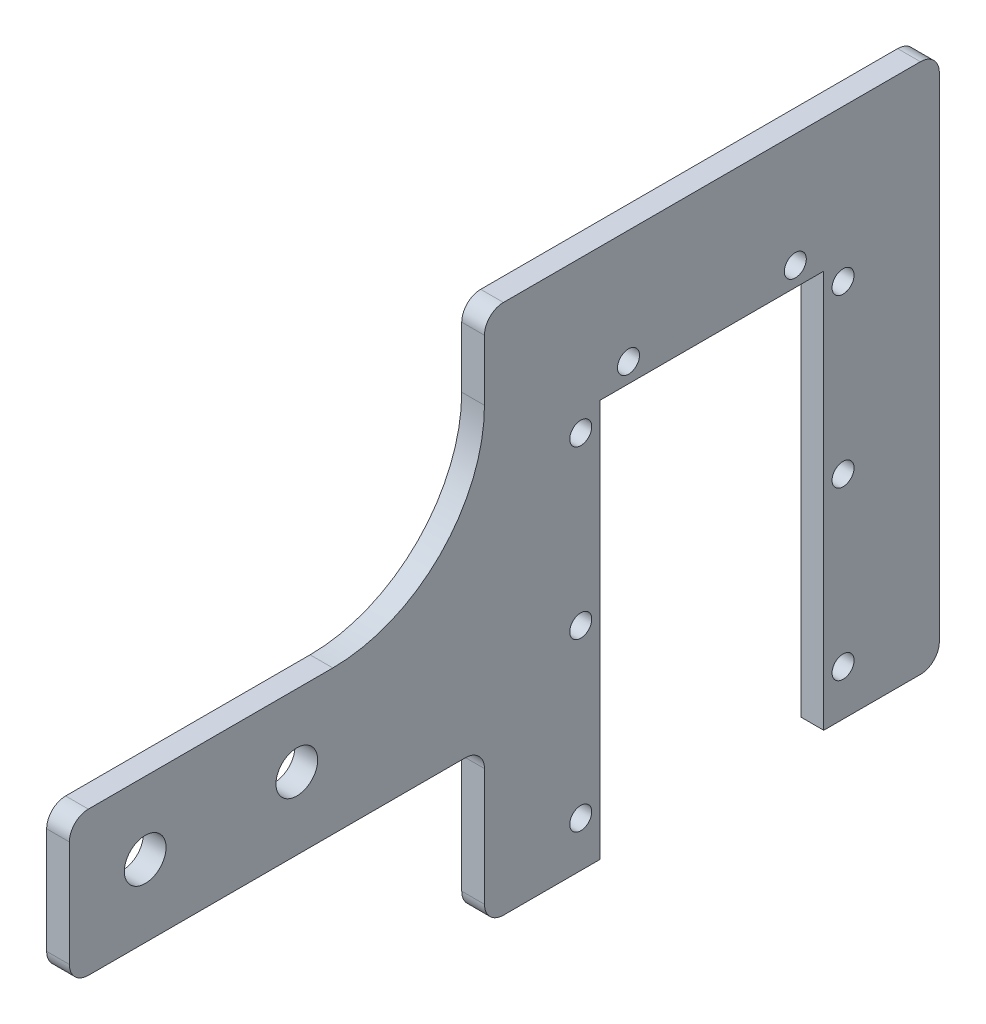
ISO-10303-21;
HEADER;
FILE_DESCRIPTION(('STEP AP214'),'2;1');
FILE_NAME('part.step','',(''),(''),'','','');
FILE_SCHEMA(('AUTOMOTIVE_DESIGN { 1 0 10303 214 1 1 1 1 }'));
ENDSEC;
DATA;
#1=APPLICATION_CONTEXT('core data for automotive mechanical design processes');
#2=APPLICATION_PROTOCOL_DEFINITION('international standard','automotive_design',2000,#1);
#3=PRODUCT_CONTEXT('',#1,'mechanical');
#4=PRODUCT('Part','Part','',(#3));
#5=PRODUCT_RELATED_PRODUCT_CATEGORY('part','',(#4));
#6=PRODUCT_DEFINITION_FORMATION('','',#4);
#7=PRODUCT_DEFINITION_CONTEXT('part definition',#1,'design');
#8=PRODUCT_DEFINITION('design','',#6,#7);
#9=PRODUCT_DEFINITION_SHAPE('','',#8);
#10=(LENGTH_UNIT() NAMED_UNIT(*) SI_UNIT(.MILLI.,.METRE.));
#11=(NAMED_UNIT(*) PLANE_ANGLE_UNIT() SI_UNIT($,.RADIAN.));
#12=(NAMED_UNIT(*) SI_UNIT($,.STERADIAN.) SOLID_ANGLE_UNIT());
#13=UNCERTAINTY_MEASURE_WITH_UNIT(LENGTH_MEASURE(1.E-05),#10,'distance_accuracy_value','');
#14=(GEOMETRIC_REPRESENTATION_CONTEXT(3) GLOBAL_UNCERTAINTY_ASSIGNED_CONTEXT((#13)) GLOBAL_UNIT_ASSIGNED_CONTEXT((#10,
#11,#12)) REPRESENTATION_CONTEXT('',''));
#15=CARTESIAN_POINT('',(0.,0.,0.));
#16=DIRECTION('',(0.,0.,1.));
#17=DIRECTION('',(1.,0.,0.));
#18=AXIS2_PLACEMENT_3D('',#15,#16,#17);
#19=CARTESIAN_POINT('',(1.5,60.,29.9999999999755));
#20=DIRECTION('',(0.,-3.49868943340579E-13,-1.));
#21=DIRECTION('',(0.,1.,-3.49868943340579E-13));
#22=AXIS2_PLACEMENT_3D('',#19,#20,#21);
#23=PLANE('',#22);
#24=DIRECTION('',(0.,-1.,3.49868943340579E-13));
#25=VECTOR('',#24,1.);
#26=CARTESIAN_POINT('',(1.5,60.,29.9999999999755));
#27=LINE('',#26,#25);
#28=CARTESIAN_POINT('',(1.5,7.99999999999873,29.9999999999937));
#29=VERTEX_POINT('',#28);
#30=CARTESIAN_POINT('',(1.5,-7.49999999999913,29.9999999999991));
#31=VERTEX_POINT('',#30);
#32=EDGE_CURVE('E325',#29,#31,#27,.T.);
#33=ORIENTED_EDGE('',*,*,#32,.F.);
#34=DIRECTION('',(1.,0.,0.));
#35=VECTOR('',#34,1.);
#36=CARTESIAN_POINT('',(-1.5,7.99999999999873,29.9999999999937));
#37=LINE('',#36,#35);
#38=CARTESIAN_POINT('',(-1.5,7.99999999999873,29.9999999999937));
#39=VERTEX_POINT('',#38);
#40=EDGE_CURVE('E257',#29,#39,#37,.F.);
#41=ORIENTED_EDGE('',*,*,#40,.T.);
#42=DIRECTION('',(0.,-1.,3.49868943340579E-13));
#43=VECTOR('',#42,1.);
#44=CARTESIAN_POINT('',(-1.5,60.,29.9999999999755));
#45=LINE('',#44,#43);
#46=CARTESIAN_POINT('',(-1.5,-7.49999999999913,29.9999999999991));
#47=VERTEX_POINT('',#46);
#48=EDGE_CURVE('E213',#39,#47,#45,.T.);
#49=ORIENTED_EDGE('',*,*,#48,.T.);
#50=DIRECTION('',(-1.,0.,0.));
#51=VECTOR('',#50,1.);
#52=CARTESIAN_POINT('',(1.5,-7.49999999999913,29.9999999999991));
#53=LINE('',#52,#51);
#54=EDGE_CURVE('E255',#47,#31,#53,.F.);
#55=ORIENTED_EDGE('',*,*,#54,.T.);
#56=EDGE_LOOP('',(#33,#41,#49,#55));
#57=FACE_BOUND('',#56,.T.);
#58=ADVANCED_FACE('F32',(#57),#23,.F.);
#59=CARTESIAN_POINT('',(-1.5,57.5000000000009,29.9999999999764));
#60=VERTEX_POINT('',#59);
#61=CARTESIAN_POINT('',(-1.5,49.4999999999925,29.9999999999792));
#62=VERTEX_POINT('',#61);
#63=EDGE_CURVE('E214',#60,#62,#45,.T.);
#64=ORIENTED_EDGE('',*,*,#63,.T.);
#65=DIRECTION('',(-1.,0.,0.));
#66=VECTOR('',#65,1.);
#67=CARTESIAN_POINT('',(1.5,49.4999999999925,29.9999999999792));
#68=LINE('',#67,#66);
#69=CARTESIAN_POINT('',(1.5,49.4999999999925,29.9999999999792));
#70=VERTEX_POINT('',#69);
#71=EDGE_CURVE('E53',#62,#70,#68,.F.);
#72=ORIENTED_EDGE('',*,*,#71,.T.);
#73=CARTESIAN_POINT('',(1.5,57.5000000000009,29.9999999999764));
#74=VERTEX_POINT('',#73);
#75=EDGE_CURVE('E181',#74,#70,#27,.T.);
#76=ORIENTED_EDGE('',*,*,#75,.F.);
#77=DIRECTION('',(-1.,0.,0.));
#78=VECTOR('',#77,1.);
#79=CARTESIAN_POINT('',(1.5,57.5000000000009,29.9999999999764));
#80=LINE('',#79,#78);
#81=EDGE_CURVE('E288',#74,#60,#80,.T.);
#82=ORIENTED_EDGE('',*,*,#81,.T.);
#83=EDGE_LOOP('',(#64,#72,#76,#82));
#84=FACE_BOUND('',#83,.T.);
#85=ADVANCED_FACE('F370',(#84),#23,.F.);
#86=CARTESIAN_POINT('',(1.5,60.,-30.0000000000245));
#87=DIRECTION('',(0.,3.49819379812694E-13,1.));
#88=DIRECTION('',(0.,-1.,3.49819379812694E-13));
#89=AXIS2_PLACEMENT_3D('',#86,#87,#88);
#90=PLANE('',#89);
#91=DIRECTION('',(0.,1.,-3.49819379812694E-13));
#92=VECTOR('',#91,1.);
#93=CARTESIAN_POINT('',(1.5,60.,-30.0000000000245));
#94=LINE('',#93,#92);
#95=CARTESIAN_POINT('',(1.5,-7.50000000000087,-30.0000000000009));
#96=VERTEX_POINT('',#95);
#97=CARTESIAN_POINT('',(1.5,57.4999999999991,-30.0000000000236));
#98=VERTEX_POINT('',#97);
#99=EDGE_CURVE('E226',#96,#98,#94,.T.);
#100=ORIENTED_EDGE('',*,*,#99,.F.);
#101=DIRECTION('',(-1.,0.,0.));
#102=VECTOR('',#101,1.);
#103=CARTESIAN_POINT('',(1.5,-7.50000000000087,-30.0000000000009));
#104=LINE('',#103,#102);
#105=CARTESIAN_POINT('',(-1.5,-7.50000000000087,-30.0000000000009));
#106=VERTEX_POINT('',#105);
#107=EDGE_CURVE('E261',#96,#106,#104,.T.);
#108=ORIENTED_EDGE('',*,*,#107,.T.);
#109=DIRECTION('',(0.,1.,-3.49819379812694E-13));
#110=VECTOR('',#109,1.);
#111=CARTESIAN_POINT('',(-1.5,60.,-30.0000000000245));
#112=LINE('',#111,#110);
#113=CARTESIAN_POINT('',(-1.5,57.4999999999991,-30.0000000000236));
#114=VERTEX_POINT('',#113);
#115=EDGE_CURVE('E206',#106,#114,#112,.T.);
#116=ORIENTED_EDGE('',*,*,#115,.T.);
#117=DIRECTION('',(-1.,0.,0.));
#118=VECTOR('',#117,1.);
#119=CARTESIAN_POINT('',(1.5,57.4999999999991,-30.0000000000236));
#120=LINE('',#119,#118);
#121=EDGE_CURVE('E259',#114,#98,#120,.F.);
#122=ORIENTED_EDGE('',*,*,#121,.T.);
#123=EDGE_LOOP('',(#100,#108,#116,#122));
#124=FACE_BOUND('',#123,.T.);
#125=ADVANCED_FACE('F356',(#124),#90,.F.);
#126=CARTESIAN_POINT('',(1.5,60.,-30.0000000000245));
#127=DIRECTION('',(0.,-1.,0.));
#128=DIRECTION('',(0.,0.,-1.));
#129=AXIS2_PLACEMENT_3D('',#126,#127,#128);
#130=PLANE('',#129);
#131=DIRECTION('',(0.,0.,1.));
#132=VECTOR('',#131,1.);
#133=CARTESIAN_POINT('',(1.5,60.,-30.0000000000245));
#134=LINE('',#133,#132);
#135=CARTESIAN_POINT('',(1.5,60.,-27.5000000000236));
#136=VERTEX_POINT('',#135);
#137=CARTESIAN_POINT('',(1.5,60.,27.4999999999764));
#138=VERTEX_POINT('',#137);
#139=EDGE_CURVE('E323',#136,#138,#134,.T.);
#140=ORIENTED_EDGE('',*,*,#139,.F.);
#141=DIRECTION('',(-1.,0.,0.));
#142=VECTOR('',#141,1.);
#143=CARTESIAN_POINT('',(1.5,60.,-27.5000000000236));
#144=LINE('',#143,#142);
#145=CARTESIAN_POINT('',(-1.5,60.,-27.5000000000236));
#146=VERTEX_POINT('',#145);
#147=EDGE_CURVE('E285',#136,#146,#144,.T.);
#148=ORIENTED_EDGE('',*,*,#147,.T.);
#149=DIRECTION('',(0.,0.,1.));
#150=VECTOR('',#149,1.);
#151=CARTESIAN_POINT('',(-1.5,60.,-30.0000000000245));
#152=LINE('',#151,#150);
#153=CARTESIAN_POINT('',(-1.5,60.,27.4999999999764));
#154=VERTEX_POINT('',#153);
#155=EDGE_CURVE('E209',#146,#154,#152,.T.);
#156=ORIENTED_EDGE('',*,*,#155,.T.);
#157=DIRECTION('',(-1.,0.,0.));
#158=VECTOR('',#157,1.);
#159=CARTESIAN_POINT('',(1.5,60.,27.4999999999764));
#160=LINE('',#159,#158);
#161=EDGE_CURVE('E283',#154,#138,#160,.F.);
#162=ORIENTED_EDGE('',*,*,#161,.T.);
#163=EDGE_LOOP('',(#140,#148,#156,#162));
#164=FACE_BOUND('',#163,.T.);
#165=ADVANCED_FACE('F364',(#164),#130,.F.);
#166=CARTESIAN_POINT('',(1.5,-10.,30.));
#167=DIRECTION('',(0.,1.,0.));
#168=DIRECTION('',(0.,0.,1.));
#169=AXIS2_PLACEMENT_3D('',#166,#167,#168);
#170=PLANE('',#169);
#171=DIRECTION('',(0.,0.,-1.));
#172=VECTOR('',#171,1.);
#173=CARTESIAN_POINT('',(1.5,-10.,30.));
#174=LINE('',#173,#172);
#175=CARTESIAN_POINT('',(1.5,-10.,27.4999999999991));
#176=VERTEX_POINT('',#175);
#177=CARTESIAN_POINT('',(1.5,-10.,14.75));
#178=VERTEX_POINT('',#177);
#179=EDGE_CURVE('E168',#176,#178,#174,.T.);
#180=ORIENTED_EDGE('',*,*,#179,.F.);
#181=DIRECTION('',(-1.,0.,0.));
#182=VECTOR('',#181,1.);
#183=CARTESIAN_POINT('',(1.5,-10.,27.4999999999991));
#184=LINE('',#183,#182);
#185=CARTESIAN_POINT('',(-1.5,-10.,27.4999999999991));
#186=VERTEX_POINT('',#185);
#187=EDGE_CURVE('E281',#176,#186,#184,.T.);
#188=ORIENTED_EDGE('',*,*,#187,.T.);
#189=DIRECTION('',(0.,0.,-1.));
#190=VECTOR('',#189,1.);
#191=CARTESIAN_POINT('',(-1.5,-10.,30.));
#192=LINE('',#191,#190);
#193=CARTESIAN_POINT('',(-1.5,-10.,14.75));
#194=VERTEX_POINT('',#193);
#195=EDGE_CURVE('E187',#186,#194,#192,.T.);
#196=ORIENTED_EDGE('',*,*,#195,.T.);
#197=DIRECTION('',(-1.,0.,0.));
#198=VECTOR('',#197,1.);
#199=CARTESIAN_POINT('',(1.5,-10.,14.75));
#200=LINE('',#199,#198);
#201=EDGE_CURVE('E184',#178,#194,#200,.T.);
#202=ORIENTED_EDGE('',*,*,#201,.F.);
#203=EDGE_LOOP('',(#180,#188,#196,#202));
#204=FACE_BOUND('',#203,.T.);
#205=ADVANCED_FACE('F185',(#204),#170,.F.);
#206=CARTESIAN_POINT('',(1.5,42.45,14.75));
#207=DIRECTION('',(0.,0.,1.));
#208=DIRECTION('',(0.,-1.,0.));
#209=AXIS2_PLACEMENT_3D('',#206,#207,#208);
#210=PLANE('',#209);
#211=DIRECTION('',(-1.,0.,0.));
#212=VECTOR('',#211,1.);
#213=CARTESIAN_POINT('',(1.5,42.45,14.75));
#214=LINE('',#213,#212);
#215=CARTESIAN_POINT('',(1.5,42.45,14.75));
#216=VERTEX_POINT('',#215);
#217=CARTESIAN_POINT('',(-1.5,42.45,14.75));
#218=VERTEX_POINT('',#217);
#219=EDGE_CURVE('E191',#216,#218,#214,.T.);
#220=ORIENTED_EDGE('',*,*,#219,.F.);
#221=DIRECTION('',(0.,1.,0.));
#222=VECTOR('',#221,1.);
#223=CARTESIAN_POINT('',(1.5,42.45,14.75));
#224=LINE('',#223,#222);
#225=EDGE_CURVE('E173',#178,#216,#224,.T.);
#226=ORIENTED_EDGE('',*,*,#225,.F.);
#227=ORIENTED_EDGE('',*,*,#201,.T.);
#228=DIRECTION('',(0.,1.,0.));
#229=VECTOR('',#228,1.);
#230=CARTESIAN_POINT('',(-1.5,42.45,14.75));
#231=LINE('',#230,#229);
#232=EDGE_CURVE('E217',#194,#218,#231,.T.);
#233=ORIENTED_EDGE('',*,*,#232,.T.);
#234=EDGE_LOOP('',(#220,#226,#227,#233));
#235=FACE_BOUND('',#234,.T.);
#236=ADVANCED_FACE('F193',(#235),#210,.F.);
#237=CARTESIAN_POINT('',(1.5,42.45,-14.75));
#238=DIRECTION('',(0.,1.,0.));
#239=DIRECTION('',(0.,0.,1.));
#240=AXIS2_PLACEMENT_3D('',#237,#238,#239);
#241=PLANE('',#240);
#242=DIRECTION('',(0.,0.,-1.));
#243=VECTOR('',#242,1.);
#244=CARTESIAN_POINT('',(-1.5,42.45,-14.75));
#245=LINE('',#244,#243);
#246=CARTESIAN_POINT('',(-1.5,42.45,-14.75));
#247=VERTEX_POINT('',#246);
#248=EDGE_CURVE('E219',#218,#247,#245,.T.);
#249=ORIENTED_EDGE('',*,*,#248,.T.);
#250=DIRECTION('',(-1.,0.,0.));
#251=VECTOR('',#250,1.);
#252=CARTESIAN_POINT('',(1.5,42.45,-14.75));
#253=LINE('',#252,#251);
#254=CARTESIAN_POINT('',(1.5,42.45,-14.75));
#255=VERTEX_POINT('',#254);
#256=EDGE_CURVE('E229',#255,#247,#253,.T.);
#257=ORIENTED_EDGE('',*,*,#256,.F.);
#258=DIRECTION('',(0.,0.,-1.));
#259=VECTOR('',#258,1.);
#260=CARTESIAN_POINT('',(1.5,42.45,-14.75));
#261=LINE('',#260,#259);
#262=EDGE_CURVE('E196',#216,#255,#261,.T.);
#263=ORIENTED_EDGE('',*,*,#262,.F.);
#264=ORIENTED_EDGE('',*,*,#219,.T.);
#265=EDGE_LOOP('',(#249,#257,#263,#264));
#266=FACE_BOUND('',#265,.T.);
#267=ADVANCED_FACE('F338',(#266),#241,.F.);
#268=CARTESIAN_POINT('',(1.5,-10.,-14.75));
#269=DIRECTION('',(0.,0.,-1.));
#270=DIRECTION('',(-1.,0.,0.));
#271=AXIS2_PLACEMENT_3D('',#268,#269,#270);
#272=PLANE('',#271);
#273=DIRECTION('',(0.,-1.,0.));
#274=VECTOR('',#273,1.);
#275=CARTESIAN_POINT('',(-1.5,-10.,-14.75));
#276=LINE('',#275,#274);
#277=CARTESIAN_POINT('',(-1.5,-10.,-14.75));
#278=VERTEX_POINT('',#277);
#279=EDGE_CURVE('E221',#247,#278,#276,.T.);
#280=ORIENTED_EDGE('',*,*,#279,.T.);
#281=DIRECTION('',(-1.,0.,0.));
#282=VECTOR('',#281,1.);
#283=CARTESIAN_POINT('',(1.5,-10.,-14.75));
#284=LINE('',#283,#282);
#285=CARTESIAN_POINT('',(1.5,-10.,-14.75));
#286=VERTEX_POINT('',#285);
#287=EDGE_CURVE('E205',#286,#278,#284,.T.);
#288=ORIENTED_EDGE('',*,*,#287,.F.);
#289=DIRECTION('',(0.,-1.,0.));
#290=VECTOR('',#289,1.);
#291=CARTESIAN_POINT('',(1.5,-10.,-14.75));
#292=LINE('',#291,#290);
#293=EDGE_CURVE('E198',#255,#286,#292,.T.);
#294=ORIENTED_EDGE('',*,*,#293,.F.);
#295=ORIENTED_EDGE('',*,*,#256,.T.);
#296=EDGE_LOOP('',(#280,#288,#294,#295));
#297=FACE_BOUND('',#296,.T.);
#298=ADVANCED_FACE('F345',(#297),#272,.F.);
#299=CARTESIAN_POINT('',(1.5,-10.,-14.75));
#300=DIRECTION('',(0.,1.,0.));
#301=DIRECTION('',(0.,0.,1.));
#302=AXIS2_PLACEMENT_3D('',#299,#300,#301);
#303=PLANE('',#302);
#304=DIRECTION('',(0.,0.,-1.));
#305=VECTOR('',#304,1.);
#306=CARTESIAN_POINT('',(-1.5,-10.,-14.75));
#307=LINE('',#306,#305);
#308=CARTESIAN_POINT('',(-1.5,-10.,-27.5000000000009));
#309=VERTEX_POINT('',#308);
#310=EDGE_CURVE('E223',#278,#309,#307,.T.);
#311=ORIENTED_EDGE('',*,*,#310,.T.);
#312=DIRECTION('',(-1.,0.,0.));
#313=VECTOR('',#312,1.);
#314=CARTESIAN_POINT('',(1.5,-10.,-27.5000000000009));
#315=LINE('',#314,#313);
#316=CARTESIAN_POINT('',(1.5,-10.,-27.5000000000009));
#317=VERTEX_POINT('',#316);
#318=EDGE_CURVE('E272',#309,#317,#315,.F.);
#319=ORIENTED_EDGE('',*,*,#318,.T.);
#320=DIRECTION('',(0.,0.,-1.));
#321=VECTOR('',#320,1.);
#322=CARTESIAN_POINT('',(1.5,-10.,-14.75));
#323=LINE('',#322,#321);
#324=EDGE_CURVE('E203',#286,#317,#323,.T.);
#325=ORIENTED_EDGE('',*,*,#324,.F.);
#326=ORIENTED_EDGE('',*,*,#287,.T.);
#327=EDGE_LOOP('',(#311,#319,#325,#326));
#328=FACE_BOUND('',#327,.T.);
#329=ADVANCED_FACE('F348',(#328),#303,.F.);
#330=CARTESIAN_POINT('',(1.5,0.,0.));
#331=DIRECTION('',(1.,0.,0.));
#332=DIRECTION('',(0.,0.,-1.));
#333=AXIS2_PLACEMENT_3D('',#330,#331,#332);
#334=PLANE('',#333);
#335=CARTESIAN_POINT('',(1.5,40.,-17.3));
#336=DIRECTION('',(1.,0.,0.));
#337=DIRECTION('',(0.,0.,-1.));
#338=AXIS2_PLACEMENT_3D('',#335,#336,#337);
#339=CIRCLE('',#338,1.45);
#340=CARTESIAN_POINT('',(1.5,40.,-18.75));
#341=VERTEX_POINT('',#340);
#342=EDGE_CURVE('E448',#341,#341,#339,.T.);
#343=ORIENTED_EDGE('',*,*,#342,.F.);
#344=EDGE_LOOP('',(#343));
#345=FACE_BOUND('',#344,.T.);
#346=CARTESIAN_POINT('',(1.5,18.,-17.3));
#347=DIRECTION('',(1.,0.,0.));
#348=DIRECTION('',(0.,0.,-1.));
#349=AXIS2_PLACEMENT_3D('',#346,#347,#348);
#350=CIRCLE('',#349,1.45);
#351=CARTESIAN_POINT('',(1.5,18.,-18.75));
#352=VERTEX_POINT('',#351);
#353=EDGE_CURVE('E442',#352,#352,#350,.T.);
#354=ORIENTED_EDGE('',*,*,#353,.F.);
#355=EDGE_LOOP('',(#354));
#356=FACE_BOUND('',#355,.T.);
#357=CARTESIAN_POINT('',(1.5,-4.,-17.3));
#358=DIRECTION('',(1.,0.,0.));
#359=DIRECTION('',(0.,0.,-1.));
#360=AXIS2_PLACEMENT_3D('',#357,#358,#359);
#361=CIRCLE('',#360,1.45);
#362=CARTESIAN_POINT('',(1.5,-4.,-18.75));
#363=VERTEX_POINT('',#362);
#364=EDGE_CURVE('E436',#363,#363,#361,.T.);
#365=ORIENTED_EDGE('',*,*,#364,.F.);
#366=EDGE_LOOP('',(#365));
#367=FACE_BOUND('',#366,.T.);
#368=CARTESIAN_POINT('',(1.5,-4.00000000000002,17.3));
#369=DIRECTION('',(1.,0.,0.));
#370=DIRECTION('',(0.,0.,-1.));
#371=AXIS2_PLACEMENT_3D('',#368,#369,#370);
#372=CIRCLE('',#371,1.45);
#373=CARTESIAN_POINT('',(1.5,-4.00000000000002,15.85));
#374=VERTEX_POINT('',#373);
#375=EDGE_CURVE('E430',#374,#374,#372,.T.);
#376=ORIENTED_EDGE('',*,*,#375,.F.);
#377=EDGE_LOOP('',(#376));
#378=FACE_BOUND('',#377,.T.);
#379=CARTESIAN_POINT('',(1.5,18.,17.3));
#380=DIRECTION('',(1.,0.,0.));
#381=DIRECTION('',(0.,0.,-1.));
#382=AXIS2_PLACEMENT_3D('',#379,#380,#381);
#383=CIRCLE('',#382,1.45);
#384=CARTESIAN_POINT('',(1.5,18.,15.85));
#385=VERTEX_POINT('',#384);
#386=EDGE_CURVE('E424',#385,#385,#383,.T.);
#387=ORIENTED_EDGE('',*,*,#386,.F.);
#388=EDGE_LOOP('',(#387));
#389=FACE_BOUND('',#388,.T.);
#390=CARTESIAN_POINT('',(1.5,40.,17.3));
#391=DIRECTION('',(1.,0.,0.));
#392=DIRECTION('',(0.,0.,-1.));
#393=AXIS2_PLACEMENT_3D('',#390,#391,#392);
#394=CIRCLE('',#393,1.45);
#395=CARTESIAN_POINT('',(1.5,40.,15.85));
#396=VERTEX_POINT('',#395);
#397=EDGE_CURVE('E418',#396,#396,#394,.T.);
#398=ORIENTED_EDGE('',*,*,#397,.F.);
#399=EDGE_LOOP('',(#398));
#400=FACE_BOUND('',#399,.T.);
#401=CARTESIAN_POINT('',(1.5,45.,11.));
#402=DIRECTION('',(1.,0.,0.));
#403=DIRECTION('',(0.,0.,-1.));
#404=AXIS2_PLACEMENT_3D('',#401,#402,#403);
#405=CIRCLE('',#404,1.45);
#406=CARTESIAN_POINT('',(1.5,45.,9.55));
#407=VERTEX_POINT('',#406);
#408=EDGE_CURVE('E412',#407,#407,#405,.T.);
#409=ORIENTED_EDGE('',*,*,#408,.F.);
#410=EDGE_LOOP('',(#409));
#411=FACE_BOUND('',#410,.T.);
#412=CARTESIAN_POINT('',(1.5,45.,-11.));
#413=DIRECTION('',(1.,0.,0.));
#414=DIRECTION('',(0.,0.,-1.));
#415=AXIS2_PLACEMENT_3D('',#412,#413,#414);
#416=CIRCLE('',#415,1.45);
#417=CARTESIAN_POINT('',(1.5,45.,-12.45));
#418=VERTEX_POINT('',#417);
#419=EDGE_CURVE('E406',#418,#418,#416,.T.);
#420=ORIENTED_EDGE('',*,*,#419,.F.);
#421=EDGE_LOOP('',(#420));
#422=FACE_BOUND('',#421,.T.);
#423=CARTESIAN_POINT('',(1.5,20.000000000002,74.75));
#424=DIRECTION('',(1.,0.,0.));
#425=DIRECTION('',(0.,0.,-1.));
#426=AXIS2_PLACEMENT_3D('',#423,#424,#425);
#427=CIRCLE('',#426,2.75);
#428=CARTESIAN_POINT('',(1.5,20.000000000002,72.));
#429=VERTEX_POINT('',#428);
#430=EDGE_CURVE('E400',#429,#429,#427,.T.);
#431=ORIENTED_EDGE('',*,*,#430,.F.);
#432=EDGE_LOOP('',(#431));
#433=FACE_BOUND('',#432,.T.);
#434=CARTESIAN_POINT('',(1.5,20.000000000002,54.75));
#435=DIRECTION('',(1.,0.,0.));
#436=DIRECTION('',(0.,0.,-1.));
#437=AXIS2_PLACEMENT_3D('',#434,#435,#436);
#438=CIRCLE('',#437,2.75);
#439=CARTESIAN_POINT('',(1.5,20.000000000002,52.));
#440=VERTEX_POINT('',#439);
#441=EDGE_CURVE('E394',#440,#440,#438,.T.);
#442=ORIENTED_EDGE('',*,*,#441,.F.);
#443=EDGE_LOOP('',(#442));
#444=FACE_BOUND('',#443,.T.);
#445=ORIENTED_EDGE('',*,*,#324,.T.);
#446=CARTESIAN_POINT('',(1.5,-7.49999999999999,-27.5000000000009));
#447=DIRECTION('',(1.,0.,0.));
#448=DIRECTION('',(0.,0.,-1.));
#449=AXIS2_PLACEMENT_3D('',#446,#447,#448);
#450=CIRCLE('',#449,2.5);
#451=EDGE_CURVE('E279',#317,#96,#450,.T.);
#452=ORIENTED_EDGE('',*,*,#451,.T.);
#453=ORIENTED_EDGE('',*,*,#99,.T.);
#454=CARTESIAN_POINT('',(1.5,57.5,-27.5000000000236));
#455=DIRECTION('',(1.,0.,0.));
#456=DIRECTION('',(0.,0.,-1.));
#457=AXIS2_PLACEMENT_3D('',#454,#455,#456);
#458=CIRCLE('',#457,2.5);
#459=EDGE_CURVE('E276',#98,#136,#458,.T.);
#460=ORIENTED_EDGE('',*,*,#459,.T.);
#461=ORIENTED_EDGE('',*,*,#139,.T.);
#462=CARTESIAN_POINT('',(1.5,57.5,27.4999999999764));
#463=DIRECTION('',(1.,0.,0.));
#464=DIRECTION('',(0.,0.,-1.));
#465=AXIS2_PLACEMENT_3D('',#462,#463,#464);
#466=CIRCLE('',#465,2.5);
#467=EDGE_CURVE('E274',#138,#74,#466,.T.);
#468=ORIENTED_EDGE('',*,*,#467,.T.);
#469=ORIENTED_EDGE('',*,*,#75,.T.);
#470=CARTESIAN_POINT('',(1.5,49.4999999999995,49.9999999999792));
#471=DIRECTION('',(1.,0.,0.));
#472=DIRECTION('',(0.,0.,-1.));
#473=AXIS2_PLACEMENT_3D('',#470,#471,#472);
#474=CIRCLE('',#473,20.);
#475=CARTESIAN_POINT('',(1.5,29.4999999999995,49.9999999999792));
#476=VERTEX_POINT('',#475);
#477=EDGE_CURVE('E11',#70,#476,#474,.F.);
#478=ORIENTED_EDGE('',*,*,#477,.T.);
#479=DIRECTION('',(0.,0.,1.));
#480=VECTOR('',#479,1.);
#481=CARTESIAN_POINT('',(1.5,29.4999999999995,84.75));
#482=LINE('',#481,#480);
#483=CARTESIAN_POINT('',(1.5,29.4999999999995,82.25));
#484=VERTEX_POINT('',#483);
#485=EDGE_CURVE('E303',#476,#484,#482,.T.);
#486=ORIENTED_EDGE('',*,*,#485,.T.);
#487=CARTESIAN_POINT('',(1.5,26.9999999999995,82.25));
#488=DIRECTION('',(1.,0.,0.));
#489=DIRECTION('',(0.,0.,-1.));
#490=AXIS2_PLACEMENT_3D('',#487,#488,#489);
#491=CIRCLE('',#490,2.5);
#492=CARTESIAN_POINT('',(1.5,26.9999999999995,84.75));
#493=VERTEX_POINT('',#492);
#494=EDGE_CURVE('E245',#484,#493,#491,.T.);
#495=ORIENTED_EDGE('',*,*,#494,.T.);
#496=DIRECTION('',(0.,-1.,0.));
#497=VECTOR('',#496,1.);
#498=CARTESIAN_POINT('',(1.5,10.4999999999996,84.75));
#499=LINE('',#498,#497);
#500=CARTESIAN_POINT('',(1.5,12.9999999999996,84.75));
#501=VERTEX_POINT('',#500);
#502=EDGE_CURVE('E210',#493,#501,#499,.T.);
#503=ORIENTED_EDGE('',*,*,#502,.T.);
#504=CARTESIAN_POINT('',(1.5,12.9999999999996,82.25));
#505=DIRECTION('',(1.,0.,0.));
#506=DIRECTION('',(0.,0.,-1.));
#507=AXIS2_PLACEMENT_3D('',#504,#505,#506);
#508=CIRCLE('',#507,2.5);
#509=CARTESIAN_POINT('',(1.5,10.4999999999996,82.25));
#510=VERTEX_POINT('',#509);
#511=EDGE_CURVE('E247',#501,#510,#508,.T.);
#512=ORIENTED_EDGE('',*,*,#511,.T.);
#513=DIRECTION('',(0.,0.,-1.));
#514=VECTOR('',#513,1.);
#515=CARTESIAN_POINT('',(1.5,10.4999999999996,84.75));
#516=LINE('',#515,#514);
#517=CARTESIAN_POINT('',(1.5,10.4999999999996,32.4999999999937));
#518=VERTEX_POINT('',#517);
#519=EDGE_CURVE('E314',#510,#518,#516,.T.);
#520=ORIENTED_EDGE('',*,*,#519,.T.);
#521=CARTESIAN_POINT('',(1.5,7.99999999999961,32.4999999999937));
#522=DIRECTION('',(1.,0.,0.));
#523=DIRECTION('',(0.,0.,-1.));
#524=AXIS2_PLACEMENT_3D('',#521,#522,#523);
#525=CIRCLE('',#524,2.5);
#526=EDGE_CURVE('E291',#518,#29,#525,.F.);
#527=ORIENTED_EDGE('',*,*,#526,.T.);
#528=ORIENTED_EDGE('',*,*,#32,.T.);
#529=CARTESIAN_POINT('',(1.5,-7.5,27.4999999999991));
#530=DIRECTION('',(1.,0.,0.));
#531=DIRECTION('',(0.,0.,-1.));
#532=AXIS2_PLACEMENT_3D('',#529,#530,#531);
#533=CIRCLE('',#532,2.5);
#534=EDGE_CURVE('E177',#31,#176,#533,.T.);
#535=ORIENTED_EDGE('',*,*,#534,.T.);
#536=ORIENTED_EDGE('',*,*,#179,.T.);
#537=ORIENTED_EDGE('',*,*,#225,.T.);
#538=ORIENTED_EDGE('',*,*,#262,.T.);
#539=ORIENTED_EDGE('',*,*,#293,.T.);
#540=EDGE_LOOP('',(#445,#452,#453,#460,#461,#468,#469,#478,#486,#495,#503,#512,#520,#527,#528,
#535,#536,#537,#538,#539));
#541=FACE_BOUND('',#540,.T.);
#542=ADVANCED_FACE('F171',(#345,#356,#367,#378,#389,#400,#411,#422,#433,#444,#541),#334,.T.);
#543=CARTESIAN_POINT('',(-1.5,0.,0.));
#544=DIRECTION('',(1.,0.,0.));
#545=DIRECTION('',(0.,0.,-1.));
#546=AXIS2_PLACEMENT_3D('',#543,#544,#545);
#547=PLANE('',#546);
#548=CARTESIAN_POINT('',(-1.5,40.,-17.3));
#549=DIRECTION('',(1.,0.,0.));
#550=DIRECTION('',(0.,0.,-1.));
#551=AXIS2_PLACEMENT_3D('',#548,#549,#550);
#552=CIRCLE('',#551,1.45);
#553=CARTESIAN_POINT('',(-1.5,40.,-18.75));
#554=VERTEX_POINT('',#553);
#555=EDGE_CURVE('E445',#554,#554,#552,.T.);
#556=ORIENTED_EDGE('',*,*,#555,.T.);
#557=EDGE_LOOP('',(#556));
#558=FACE_BOUND('',#557,.T.);
#559=CARTESIAN_POINT('',(-1.5,18.,-17.3));
#560=DIRECTION('',(1.,0.,0.));
#561=DIRECTION('',(0.,0.,-1.));
#562=AXIS2_PLACEMENT_3D('',#559,#560,#561);
#563=CIRCLE('',#562,1.45);
#564=CARTESIAN_POINT('',(-1.5,18.,-18.75));
#565=VERTEX_POINT('',#564);
#566=EDGE_CURVE('E439',#565,#565,#563,.T.);
#567=ORIENTED_EDGE('',*,*,#566,.T.);
#568=EDGE_LOOP('',(#567));
#569=FACE_BOUND('',#568,.T.);
#570=CARTESIAN_POINT('',(-1.5,-4.,-17.3));
#571=DIRECTION('',(1.,0.,0.));
#572=DIRECTION('',(0.,0.,-1.));
#573=AXIS2_PLACEMENT_3D('',#570,#571,#572);
#574=CIRCLE('',#573,1.45);
#575=CARTESIAN_POINT('',(-1.5,-4.,-18.75));
#576=VERTEX_POINT('',#575);
#577=EDGE_CURVE('E433',#576,#576,#574,.T.);
#578=ORIENTED_EDGE('',*,*,#577,.T.);
#579=EDGE_LOOP('',(#578));
#580=FACE_BOUND('',#579,.T.);
#581=CARTESIAN_POINT('',(-1.5,-4.00000000000002,17.3));
#582=DIRECTION('',(1.,0.,0.));
#583=DIRECTION('',(0.,0.,-1.));
#584=AXIS2_PLACEMENT_3D('',#581,#582,#583);
#585=CIRCLE('',#584,1.45);
#586=CARTESIAN_POINT('',(-1.5,-4.00000000000002,15.85));
#587=VERTEX_POINT('',#586);
#588=EDGE_CURVE('E427',#587,#587,#585,.T.);
#589=ORIENTED_EDGE('',*,*,#588,.T.);
#590=EDGE_LOOP('',(#589));
#591=FACE_BOUND('',#590,.T.);
#592=CARTESIAN_POINT('',(-1.5,18.,17.3));
#593=DIRECTION('',(1.,0.,0.));
#594=DIRECTION('',(0.,0.,-1.));
#595=AXIS2_PLACEMENT_3D('',#592,#593,#594);
#596=CIRCLE('',#595,1.45);
#597=CARTESIAN_POINT('',(-1.5,18.,15.85));
#598=VERTEX_POINT('',#597);
#599=EDGE_CURVE('E421',#598,#598,#596,.T.);
#600=ORIENTED_EDGE('',*,*,#599,.T.);
#601=EDGE_LOOP('',(#600));
#602=FACE_BOUND('',#601,.T.);
#603=CARTESIAN_POINT('',(-1.5,40.,17.3));
#604=DIRECTION('',(1.,0.,0.));
#605=DIRECTION('',(0.,0.,-1.));
#606=AXIS2_PLACEMENT_3D('',#603,#604,#605);
#607=CIRCLE('',#606,1.45);
#608=CARTESIAN_POINT('',(-1.5,40.,15.85));
#609=VERTEX_POINT('',#608);
#610=EDGE_CURVE('E415',#609,#609,#607,.T.);
#611=ORIENTED_EDGE('',*,*,#610,.T.);
#612=EDGE_LOOP('',(#611));
#613=FACE_BOUND('',#612,.T.);
#614=CARTESIAN_POINT('',(-1.5,45.,11.));
#615=DIRECTION('',(1.,0.,0.));
#616=DIRECTION('',(0.,0.,-1.));
#617=AXIS2_PLACEMENT_3D('',#614,#615,#616);
#618=CIRCLE('',#617,1.45);
#619=CARTESIAN_POINT('',(-1.5,45.,9.55));
#620=VERTEX_POINT('',#619);
#621=EDGE_CURVE('E409',#620,#620,#618,.T.);
#622=ORIENTED_EDGE('',*,*,#621,.T.);
#623=EDGE_LOOP('',(#622));
#624=FACE_BOUND('',#623,.T.);
#625=CARTESIAN_POINT('',(-1.5,45.,-11.));
#626=DIRECTION('',(1.,0.,0.));
#627=DIRECTION('',(0.,0.,-1.));
#628=AXIS2_PLACEMENT_3D('',#625,#626,#627);
#629=CIRCLE('',#628,1.45);
#630=CARTESIAN_POINT('',(-1.5,45.,-12.45));
#631=VERTEX_POINT('',#630);
#632=EDGE_CURVE('E403',#631,#631,#629,.T.);
#633=ORIENTED_EDGE('',*,*,#632,.T.);
#634=EDGE_LOOP('',(#633));
#635=FACE_BOUND('',#634,.T.);
#636=CARTESIAN_POINT('',(-1.5,20.000000000002,74.75));
#637=DIRECTION('',(1.,0.,0.));
#638=DIRECTION('',(0.,0.,-1.));
#639=AXIS2_PLACEMENT_3D('',#636,#637,#638);
#640=CIRCLE('',#639,2.75);
#641=CARTESIAN_POINT('',(-1.5,20.000000000002,72.));
#642=VERTEX_POINT('',#641);
#643=EDGE_CURVE('E397',#642,#642,#640,.T.);
#644=ORIENTED_EDGE('',*,*,#643,.T.);
#645=EDGE_LOOP('',(#644));
#646=FACE_BOUND('',#645,.T.);
#647=CARTESIAN_POINT('',(-1.5,20.000000000002,54.75));
#648=DIRECTION('',(1.,0.,0.));
#649=DIRECTION('',(0.,0.,-1.));
#650=AXIS2_PLACEMENT_3D('',#647,#648,#649);
#651=CIRCLE('',#650,2.75);
#652=CARTESIAN_POINT('',(-1.5,20.000000000002,52.));
#653=VERTEX_POINT('',#652);
#654=EDGE_CURVE('E317',#653,#653,#651,.T.);
#655=ORIENTED_EDGE('',*,*,#654,.T.);
#656=EDGE_LOOP('',(#655));
#657=FACE_BOUND('',#656,.T.);
#658=ORIENTED_EDGE('',*,*,#115,.F.);
#659=CARTESIAN_POINT('',(-1.5,-7.49999999999999,-27.5000000000009));
#660=DIRECTION('',(1.,0.,0.));
#661=DIRECTION('',(0.,0.,-1.));
#662=AXIS2_PLACEMENT_3D('',#659,#660,#661);
#663=CIRCLE('',#662,2.5);
#664=EDGE_CURVE('E270',#106,#309,#663,.F.);
#665=ORIENTED_EDGE('',*,*,#664,.T.);
#666=ORIENTED_EDGE('',*,*,#310,.F.);
#667=ORIENTED_EDGE('',*,*,#279,.F.);
#668=ORIENTED_EDGE('',*,*,#248,.F.);
#669=ORIENTED_EDGE('',*,*,#232,.F.);
#670=ORIENTED_EDGE('',*,*,#195,.F.);
#671=CARTESIAN_POINT('',(-1.5,-7.5,27.4999999999991));
#672=DIRECTION('',(1.,0.,0.));
#673=DIRECTION('',(0.,0.,-1.));
#674=AXIS2_PLACEMENT_3D('',#671,#672,#673);
#675=CIRCLE('',#674,2.5);
#676=EDGE_CURVE('E268',#186,#47,#675,.F.);
#677=ORIENTED_EDGE('',*,*,#676,.T.);
#678=ORIENTED_EDGE('',*,*,#48,.F.);
#679=CARTESIAN_POINT('',(-1.5,7.99999999999961,32.4999999999937));
#680=DIRECTION('',(1.,0.,0.));
#681=DIRECTION('',(0.,0.,-1.));
#682=AXIS2_PLACEMENT_3D('',#679,#680,#681);
#683=CIRCLE('',#682,2.5);
#684=CARTESIAN_POINT('',(-1.5,10.4999999999996,32.4999999999937));
#685=VERTEX_POINT('',#684);
#686=EDGE_CURVE('E293',#39,#685,#683,.T.);
#687=ORIENTED_EDGE('',*,*,#686,.T.);
#688=DIRECTION('',(0.,0.,-1.));
#689=VECTOR('',#688,1.);
#690=CARTESIAN_POINT('',(-1.5,10.4999999999996,84.75));
#691=LINE('',#690,#689);
#692=CARTESIAN_POINT('',(-1.5,10.4999999999996,82.25));
#693=VERTEX_POINT('',#692);
#694=EDGE_CURVE('E311',#693,#685,#691,.T.);
#695=ORIENTED_EDGE('',*,*,#694,.F.);
#696=CARTESIAN_POINT('',(-1.5,12.9999999999996,82.25));
#697=DIRECTION('',(1.,0.,0.));
#698=DIRECTION('',(0.,0.,-1.));
#699=AXIS2_PLACEMENT_3D('',#696,#697,#698);
#700=CIRCLE('',#699,2.5);
#701=CARTESIAN_POINT('',(-1.5,12.9999999999996,84.75));
#702=VERTEX_POINT('',#701);
#703=EDGE_CURVE('E238',#693,#702,#700,.F.);
#704=ORIENTED_EDGE('',*,*,#703,.T.);
#705=DIRECTION('',(0.,-1.,0.));
#706=VECTOR('',#705,1.);
#707=CARTESIAN_POINT('',(-1.5,10.4999999999996,84.75));
#708=LINE('',#707,#706);
#709=CARTESIAN_POINT('',(-1.5,26.9999999999995,84.75));
#710=VERTEX_POINT('',#709);
#711=EDGE_CURVE('E310',#710,#702,#708,.T.);
#712=ORIENTED_EDGE('',*,*,#711,.F.);
#713=CARTESIAN_POINT('',(-1.5,26.9999999999995,82.25));
#714=DIRECTION('',(1.,0.,0.));
#715=DIRECTION('',(0.,0.,-1.));
#716=AXIS2_PLACEMENT_3D('',#713,#714,#715);
#717=CIRCLE('',#716,2.5);
#718=CARTESIAN_POINT('',(-1.5,29.4999999999995,82.25));
#719=VERTEX_POINT('',#718);
#720=EDGE_CURVE('E235',#710,#719,#717,.F.);
#721=ORIENTED_EDGE('',*,*,#720,.T.);
#722=DIRECTION('',(0.,0.,1.));
#723=VECTOR('',#722,1.);
#724=CARTESIAN_POINT('',(-1.5,29.4999999999995,84.75));
#725=LINE('',#724,#723);
#726=CARTESIAN_POINT('',(-1.5,29.4999999999995,49.9999999999792));
#727=VERTEX_POINT('',#726);
#728=EDGE_CURVE('E302',#727,#719,#725,.T.);
#729=ORIENTED_EDGE('',*,*,#728,.F.);
#730=CARTESIAN_POINT('',(-1.5,49.4999999999995,49.9999999999792));
#731=DIRECTION('',(1.,0.,0.));
#732=DIRECTION('',(0.,0.,-1.));
#733=AXIS2_PLACEMENT_3D('',#730,#731,#732);
#734=CIRCLE('',#733,20.);
#735=EDGE_CURVE('E40',#727,#62,#734,.T.);
#736=ORIENTED_EDGE('',*,*,#735,.T.);
#737=ORIENTED_EDGE('',*,*,#63,.F.);
#738=CARTESIAN_POINT('',(-1.5,57.5,27.4999999999764));
#739=DIRECTION('',(1.,0.,0.));
#740=DIRECTION('',(0.,0.,-1.));
#741=AXIS2_PLACEMENT_3D('',#738,#739,#740);
#742=CIRCLE('',#741,2.5);
#743=EDGE_CURVE('E264',#60,#154,#742,.F.);
#744=ORIENTED_EDGE('',*,*,#743,.T.);
#745=ORIENTED_EDGE('',*,*,#155,.F.);
#746=CARTESIAN_POINT('',(-1.5,57.5,-27.5000000000236));
#747=DIRECTION('',(1.,0.,0.));
#748=DIRECTION('',(0.,0.,-1.));
#749=AXIS2_PLACEMENT_3D('',#746,#747,#748);
#750=CIRCLE('',#749,2.5);
#751=EDGE_CURVE('E266',#146,#114,#750,.F.);
#752=ORIENTED_EDGE('',*,*,#751,.T.);
#753=EDGE_LOOP('',(#658,#665,#666,#667,#668,#669,#670,#677,#678,#687,#695,#704,#712,#721,#729,
#736,#737,#744,#745,#752));
#754=FACE_BOUND('',#753,.T.);
#755=ADVANCED_FACE('F307',(#558,#569,#580,#591,#602,#613,#624,#635,#646,#657,#754),#547,.F.);
#756=CARTESIAN_POINT('',(1.5,10.4999999999996,84.75));
#757=DIRECTION('',(0.,1.,0.));
#758=DIRECTION('',(0.,0.,1.));
#759=AXIS2_PLACEMENT_3D('',#756,#757,#758);
#760=PLANE('',#759);
#761=ORIENTED_EDGE('',*,*,#694,.T.);
#762=DIRECTION('',(1.,0.,0.));
#763=VECTOR('',#762,1.);
#764=CARTESIAN_POINT('',(1.5,10.4999999999996,32.4999999999937));
#765=LINE('',#764,#763);
#766=EDGE_CURVE('E252',#685,#518,#765,.T.);
#767=ORIENTED_EDGE('',*,*,#766,.T.);
#768=ORIENTED_EDGE('',*,*,#519,.F.);
#769=DIRECTION('',(-1.,0.,0.));
#770=VECTOR('',#769,1.);
#771=CARTESIAN_POINT('',(1.5,10.4999999999996,82.25));
#772=LINE('',#771,#770);
#773=EDGE_CURVE('E190',#510,#693,#772,.T.);
#774=ORIENTED_EDGE('',*,*,#773,.T.);
#775=EDGE_LOOP('',(#761,#767,#768,#774));
#776=FACE_BOUND('',#775,.T.);
#777=ADVANCED_FACE('F388',(#776),#760,.F.);
#778=CARTESIAN_POINT('',(1.5,29.4999999999995,84.75));
#779=DIRECTION('',(0.,-1.,0.));
#780=DIRECTION('',(0.,0.,-1.));
#781=AXIS2_PLACEMENT_3D('',#778,#779,#780);
#782=PLANE('',#781);
#783=ORIENTED_EDGE('',*,*,#485,.F.);
#784=DIRECTION('',(-1.,0.,0.));
#785=VECTOR('',#784,1.);
#786=CARTESIAN_POINT('',(-1.5,29.4999999999995,49.9999999999792));
#787=LINE('',#786,#785);
#788=EDGE_CURVE('E295',#476,#727,#787,.T.);
#789=ORIENTED_EDGE('',*,*,#788,.T.);
#790=ORIENTED_EDGE('',*,*,#728,.T.);
#791=DIRECTION('',(-1.,0.,0.));
#792=VECTOR('',#791,1.);
#793=CARTESIAN_POINT('',(1.5,29.4999999999995,82.25));
#794=LINE('',#793,#792);
#795=EDGE_CURVE('E249',#719,#484,#794,.F.);
#796=ORIENTED_EDGE('',*,*,#795,.T.);
#797=EDGE_LOOP('',(#783,#789,#790,#796));
#798=FACE_BOUND('',#797,.T.);
#799=ADVANCED_FACE('F301',(#798),#782,.F.);
#800=CARTESIAN_POINT('',(1.5,10.4999999999996,84.75));
#801=DIRECTION('',(0.,0.,-1.));
#802=DIRECTION('',(-1.,0.,0.));
#803=AXIS2_PLACEMENT_3D('',#800,#801,#802);
#804=PLANE('',#803);
#805=ORIENTED_EDGE('',*,*,#711,.T.);
#806=DIRECTION('',(-1.,0.,0.));
#807=VECTOR('',#806,1.);
#808=CARTESIAN_POINT('',(1.5,12.9999999999996,84.75));
#809=LINE('',#808,#807);
#810=EDGE_CURVE('E243',#702,#501,#809,.F.);
#811=ORIENTED_EDGE('',*,*,#810,.T.);
#812=ORIENTED_EDGE('',*,*,#502,.F.);
#813=DIRECTION('',(-1.,0.,0.));
#814=VECTOR('',#813,1.);
#815=CARTESIAN_POINT('',(1.5,26.9999999999995,84.75));
#816=LINE('',#815,#814);
#817=EDGE_CURVE('E240',#493,#710,#816,.T.);
#818=ORIENTED_EDGE('',*,*,#817,.T.);
#819=EDGE_LOOP('',(#805,#811,#812,#818));
#820=FACE_BOUND('',#819,.T.);
#821=ADVANCED_FACE('F379',(#820),#804,.F.);
#822=CARTESIAN_POINT('',(1.5,20.000000000002,54.75));
#823=DIRECTION('',(1.,0.,0.));
#824=DIRECTION('',(0.,0.,-1.));
#825=AXIS2_PLACEMENT_3D('',#822,#823,#824);
#826=CYLINDRICAL_SURFACE('',#825,2.75);
#827=ORIENTED_EDGE('',*,*,#654,.F.);
#828=EDGE_LOOP('',(#827));
#829=FACE_BOUND('',#828,.T.);
#830=ORIENTED_EDGE('',*,*,#441,.T.);
#831=EDGE_LOOP('',(#830));
#832=FACE_BOUND('',#831,.T.);
#833=ADVANCED_FACE('F475',(#829,#832),#826,.F.);
#834=CARTESIAN_POINT('',(1.5,20.000000000002,74.75));
#835=DIRECTION('',(1.,0.,0.));
#836=DIRECTION('',(0.,0.,-1.));
#837=AXIS2_PLACEMENT_3D('',#834,#835,#836);
#838=CYLINDRICAL_SURFACE('',#837,2.75);
#839=ORIENTED_EDGE('',*,*,#643,.F.);
#840=EDGE_LOOP('',(#839));
#841=FACE_BOUND('',#840,.T.);
#842=ORIENTED_EDGE('',*,*,#430,.T.);
#843=EDGE_LOOP('',(#842));
#844=FACE_BOUND('',#843,.T.);
#845=ADVANCED_FACE('F477',(#841,#844),#838,.F.);
#846=CARTESIAN_POINT('',(1.5,12.9999999999996,82.25));
#847=DIRECTION('',(-1.,0.,0.));
#848=DIRECTION('',(0.,0.,1.));
#849=AXIS2_PLACEMENT_3D('',#846,#847,#848);
#850=CYLINDRICAL_SURFACE('',#849,2.5);
#851=ORIENTED_EDGE('',*,*,#511,.F.);
#852=ORIENTED_EDGE('',*,*,#810,.F.);
#853=ORIENTED_EDGE('',*,*,#703,.F.);
#854=ORIENTED_EDGE('',*,*,#773,.F.);
#855=EDGE_LOOP('',(#851,#852,#853,#854));
#856=FACE_BOUND('',#855,.T.);
#857=ADVANCED_FACE('F385',(#856),#850,.T.);
#858=CARTESIAN_POINT('',(1.5,26.9999999999995,82.25));
#859=DIRECTION('',(-1.,0.,0.));
#860=DIRECTION('',(0.,0.,1.));
#861=AXIS2_PLACEMENT_3D('',#858,#859,#860);
#862=CYLINDRICAL_SURFACE('',#861,2.5);
#863=ORIENTED_EDGE('',*,*,#494,.F.);
#864=ORIENTED_EDGE('',*,*,#795,.F.);
#865=ORIENTED_EDGE('',*,*,#720,.F.);
#866=ORIENTED_EDGE('',*,*,#817,.F.);
#867=EDGE_LOOP('',(#863,#864,#865,#866));
#868=FACE_BOUND('',#867,.T.);
#869=ADVANCED_FACE('F377',(#868),#862,.T.);
#870=CARTESIAN_POINT('',(1.5,7.99999999999961,32.4999999999937));
#871=DIRECTION('',(-1.,0.,0.));
#872=DIRECTION('',(0.,0.,1.));
#873=AXIS2_PLACEMENT_3D('',#870,#871,#872);
#874=CYLINDRICAL_SURFACE('',#873,2.5);
#875=ORIENTED_EDGE('',*,*,#686,.F.);
#876=ORIENTED_EDGE('',*,*,#40,.F.);
#877=ORIENTED_EDGE('',*,*,#526,.F.);
#878=ORIENTED_EDGE('',*,*,#766,.F.);
#879=EDGE_LOOP('',(#875,#876,#877,#878));
#880=FACE_BOUND('',#879,.T.);
#881=ADVANCED_FACE('F504',(#880),#874,.F.);
#882=CARTESIAN_POINT('',(1.5,-7.49999999999999,-27.5000000000009));
#883=DIRECTION('',(-1.,0.,0.));
#884=DIRECTION('',(0.,0.,1.));
#885=AXIS2_PLACEMENT_3D('',#882,#883,#884);
#886=CYLINDRICAL_SURFACE('',#885,2.5);
#887=ORIENTED_EDGE('',*,*,#451,.F.);
#888=ORIENTED_EDGE('',*,*,#318,.F.);
#889=ORIENTED_EDGE('',*,*,#664,.F.);
#890=ORIENTED_EDGE('',*,*,#107,.F.);
#891=EDGE_LOOP('',(#887,#888,#889,#890));
#892=FACE_BOUND('',#891,.T.);
#893=ADVANCED_FACE('F351',(#892),#886,.T.);
#894=CARTESIAN_POINT('',(1.5,-7.5,27.4999999999991));
#895=DIRECTION('',(-1.,0.,0.));
#896=DIRECTION('',(0.,0.,1.));
#897=AXIS2_PLACEMENT_3D('',#894,#895,#896);
#898=CYLINDRICAL_SURFACE('',#897,2.5);
#899=ORIENTED_EDGE('',*,*,#534,.F.);
#900=ORIENTED_EDGE('',*,*,#54,.F.);
#901=ORIENTED_EDGE('',*,*,#676,.F.);
#902=ORIENTED_EDGE('',*,*,#187,.F.);
#903=EDGE_LOOP('',(#899,#900,#901,#902));
#904=FACE_BOUND('',#903,.T.);
#905=ADVANCED_FACE('F332',(#904),#898,.T.);
#906=CARTESIAN_POINT('',(1.5,57.5,-27.5000000000236));
#907=DIRECTION('',(-1.,0.,0.));
#908=DIRECTION('',(0.,0.,1.));
#909=AXIS2_PLACEMENT_3D('',#906,#907,#908);
#910=CYLINDRICAL_SURFACE('',#909,2.5);
#911=ORIENTED_EDGE('',*,*,#459,.F.);
#912=ORIENTED_EDGE('',*,*,#121,.F.);
#913=ORIENTED_EDGE('',*,*,#751,.F.);
#914=ORIENTED_EDGE('',*,*,#147,.F.);
#915=EDGE_LOOP('',(#911,#912,#913,#914));
#916=FACE_BOUND('',#915,.T.);
#917=ADVANCED_FACE('F359',(#916),#910,.T.);
#918=CARTESIAN_POINT('',(1.5,57.5,27.4999999999764));
#919=DIRECTION('',(-1.,0.,0.));
#920=DIRECTION('',(0.,0.,1.));
#921=AXIS2_PLACEMENT_3D('',#918,#919,#920);
#922=CYLINDRICAL_SURFACE('',#921,2.5);
#923=ORIENTED_EDGE('',*,*,#467,.F.);
#924=ORIENTED_EDGE('',*,*,#161,.F.);
#925=ORIENTED_EDGE('',*,*,#743,.F.);
#926=ORIENTED_EDGE('',*,*,#81,.F.);
#927=EDGE_LOOP('',(#923,#924,#925,#926));
#928=FACE_BOUND('',#927,.T.);
#929=ADVANCED_FACE('F368',(#928),#922,.T.);
#930=CARTESIAN_POINT('',(1.5,45.,-11.));
#931=DIRECTION('',(1.,0.,0.));
#932=DIRECTION('',(0.,0.,-1.));
#933=AXIS2_PLACEMENT_3D('',#930,#931,#932);
#934=CYLINDRICAL_SURFACE('',#933,1.45);
#935=ORIENTED_EDGE('',*,*,#632,.F.);
#936=EDGE_LOOP('',(#935));
#937=FACE_BOUND('',#936,.T.);
#938=ORIENTED_EDGE('',*,*,#419,.T.);
#939=EDGE_LOOP('',(#938));
#940=FACE_BOUND('',#939,.T.);
#941=ADVANCED_FACE('F514',(#937,#940),#934,.F.);
#942=CARTESIAN_POINT('',(1.5,45.,11.));
#943=DIRECTION('',(1.,0.,0.));
#944=DIRECTION('',(0.,0.,-1.));
#945=AXIS2_PLACEMENT_3D('',#942,#943,#944);
#946=CYLINDRICAL_SURFACE('',#945,1.45);
#947=ORIENTED_EDGE('',*,*,#621,.F.);
#948=EDGE_LOOP('',(#947));
#949=FACE_BOUND('',#948,.T.);
#950=ORIENTED_EDGE('',*,*,#408,.T.);
#951=EDGE_LOOP('',(#950));
#952=FACE_BOUND('',#951,.T.);
#953=ADVANCED_FACE('F518',(#949,#952),#946,.F.);
#954=CARTESIAN_POINT('',(1.5,40.,17.3));
#955=DIRECTION('',(1.,0.,0.));
#956=DIRECTION('',(0.,0.,-1.));
#957=AXIS2_PLACEMENT_3D('',#954,#955,#956);
#958=CYLINDRICAL_SURFACE('',#957,1.45);
#959=ORIENTED_EDGE('',*,*,#610,.F.);
#960=EDGE_LOOP('',(#959));
#961=FACE_BOUND('',#960,.T.);
#962=ORIENTED_EDGE('',*,*,#397,.T.);
#963=EDGE_LOOP('',(#962));
#964=FACE_BOUND('',#963,.T.);
#965=ADVANCED_FACE('F524',(#961,#964),#958,.F.);
#966=CARTESIAN_POINT('',(1.5,18.,17.3));
#967=DIRECTION('',(1.,0.,0.));
#968=DIRECTION('',(0.,0.,-1.));
#969=AXIS2_PLACEMENT_3D('',#966,#967,#968);
#970=CYLINDRICAL_SURFACE('',#969,1.45);
#971=ORIENTED_EDGE('',*,*,#599,.F.);
#972=EDGE_LOOP('',(#971));
#973=FACE_BOUND('',#972,.T.);
#974=ORIENTED_EDGE('',*,*,#386,.T.);
#975=EDGE_LOOP('',(#974));
#976=FACE_BOUND('',#975,.T.);
#977=ADVANCED_FACE('F532',(#973,#976),#970,.F.);
#978=CARTESIAN_POINT('',(1.5,-4.00000000000002,17.3));
#979=DIRECTION('',(1.,0.,0.));
#980=DIRECTION('',(0.,0.,-1.));
#981=AXIS2_PLACEMENT_3D('',#978,#979,#980);
#982=CYLINDRICAL_SURFACE('',#981,1.45);
#983=ORIENTED_EDGE('',*,*,#588,.F.);
#984=EDGE_LOOP('',(#983));
#985=FACE_BOUND('',#984,.T.);
#986=ORIENTED_EDGE('',*,*,#375,.T.);
#987=EDGE_LOOP('',(#986));
#988=FACE_BOUND('',#987,.T.);
#989=ADVANCED_FACE('F536',(#985,#988),#982,.F.);
#990=CARTESIAN_POINT('',(1.5,-4.,-17.3));
#991=DIRECTION('',(1.,0.,0.));
#992=DIRECTION('',(0.,0.,-1.));
#993=AXIS2_PLACEMENT_3D('',#990,#991,#992);
#994=CYLINDRICAL_SURFACE('',#993,1.45);
#995=ORIENTED_EDGE('',*,*,#577,.F.);
#996=EDGE_LOOP('',(#995));
#997=FACE_BOUND('',#996,.T.);
#998=ORIENTED_EDGE('',*,*,#364,.T.);
#999=EDGE_LOOP('',(#998));
#1000=FACE_BOUND('',#999,.T.);
#1001=ADVANCED_FACE('F540',(#997,#1000),#994,.F.);
#1002=CARTESIAN_POINT('',(1.5,18.,-17.3));
#1003=DIRECTION('',(1.,0.,0.));
#1004=DIRECTION('',(0.,0.,-1.));
#1005=AXIS2_PLACEMENT_3D('',#1002,#1003,#1004);
#1006=CYLINDRICAL_SURFACE('',#1005,1.45);
#1007=ORIENTED_EDGE('',*,*,#566,.F.);
#1008=EDGE_LOOP('',(#1007));
#1009=FACE_BOUND('',#1008,.T.);
#1010=ORIENTED_EDGE('',*,*,#353,.T.);
#1011=EDGE_LOOP('',(#1010));
#1012=FACE_BOUND('',#1011,.T.);
#1013=ADVANCED_FACE('F544',(#1009,#1012),#1006,.F.);
#1014=CARTESIAN_POINT('',(1.5,40.,-17.3));
#1015=DIRECTION('',(1.,0.,0.));
#1016=DIRECTION('',(0.,0.,-1.));
#1017=AXIS2_PLACEMENT_3D('',#1014,#1015,#1016);
#1018=CYLINDRICAL_SURFACE('',#1017,1.45);
#1019=ORIENTED_EDGE('',*,*,#555,.F.);
#1020=EDGE_LOOP('',(#1019));
#1021=FACE_BOUND('',#1020,.T.);
#1022=ORIENTED_EDGE('',*,*,#342,.T.);
#1023=EDGE_LOOP('',(#1022));
#1024=FACE_BOUND('',#1023,.T.);
#1025=ADVANCED_FACE('F452',(#1021,#1024),#1018,.F.);
#1026=CARTESIAN_POINT('',(1.5,49.4999999999995,49.9999999999792));
#1027=DIRECTION('',(1.,0.,0.));
#1028=DIRECTION('',(0.,0.,-1.));
#1029=AXIS2_PLACEMENT_3D('',#1026,#1027,#1028);
#1030=CYLINDRICAL_SURFACE('',#1029,20.);
#1031=ORIENTED_EDGE('',*,*,#477,.F.);
#1032=ORIENTED_EDGE('',*,*,#71,.F.);
#1033=ORIENTED_EDGE('',*,*,#735,.F.);
#1034=ORIENTED_EDGE('',*,*,#788,.F.);
#1035=EDGE_LOOP('',(#1031,#1032,#1033,#1034));
#1036=FACE_BOUND('',#1035,.T.);
#1037=ADVANCED_FACE('F34',(#1036),#1030,.F.);
#1038=CLOSED_SHELL('',(#58,#85,#125,#165,#205,#236,#267,#298,#329,#542,#755,#777,#799,#821,#833,
#845,#857,#869,#881,#893,#905,#917,#929,#941,#953,#965,#977,#989,#1001,#1013,#1025,#1037));
#1039=MANIFOLD_SOLID_BREP('B2',#1038);
#1040=ADVANCED_BREP_SHAPE_REPRESENTATION('',(#18,#1039),#14);
#1041=SHAPE_DEFINITION_REPRESENTATION(#9,#1040);
ENDSEC;
END-ISO-10303-21;
